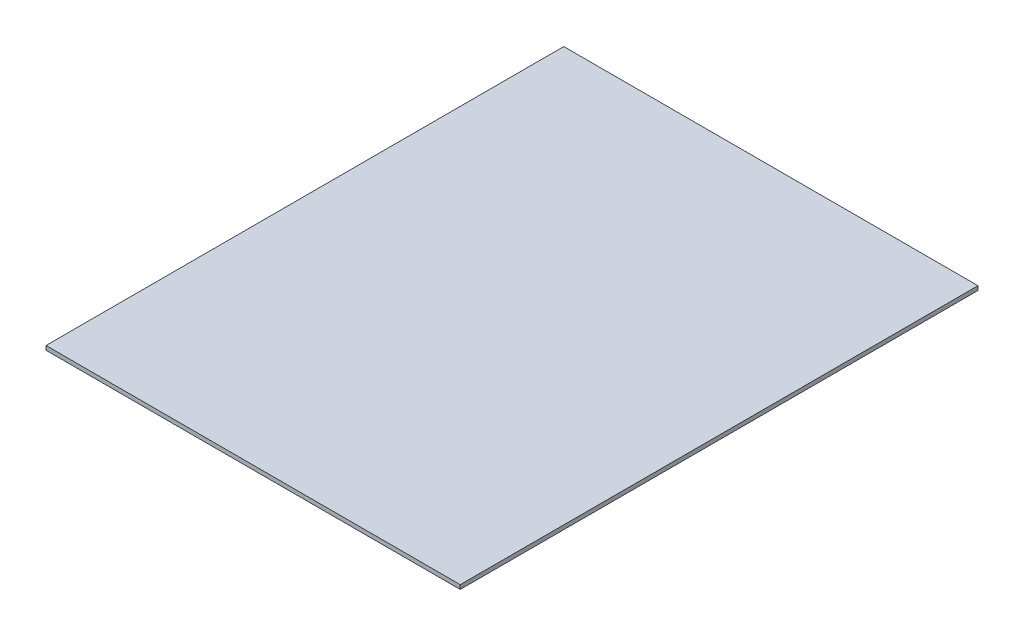
ISO-10303-21;
HEADER;
FILE_DESCRIPTION(('STEP AP214'),'2;1');
FILE_NAME('part.step','',(''),(''),'','','');
FILE_SCHEMA(('AUTOMOTIVE_DESIGN { 1 0 10303 214 1 1 1 1 }'));
ENDSEC;
DATA;
#1=APPLICATION_CONTEXT('core data for automotive mechanical design processes');
#2=APPLICATION_PROTOCOL_DEFINITION('international standard','automotive_design',2000,#1);
#3=PRODUCT_CONTEXT('',#1,'mechanical');
#4=PRODUCT('Part','Part','',(#3));
#5=PRODUCT_RELATED_PRODUCT_CATEGORY('part','',(#4));
#6=PRODUCT_DEFINITION_FORMATION('','',#4);
#7=PRODUCT_DEFINITION_CONTEXT('part definition',#1,'design');
#8=PRODUCT_DEFINITION('design','',#6,#7);
#9=PRODUCT_DEFINITION_SHAPE('','',#8);
#10=(LENGTH_UNIT() NAMED_UNIT(*) SI_UNIT(.MILLI.,.METRE.));
#11=(NAMED_UNIT(*) PLANE_ANGLE_UNIT() SI_UNIT($,.RADIAN.));
#12=(NAMED_UNIT(*) SI_UNIT($,.STERADIAN.) SOLID_ANGLE_UNIT());
#13=UNCERTAINTY_MEASURE_WITH_UNIT(LENGTH_MEASURE(1.E-05),#10,'distance_accuracy_value','');
#14=(GEOMETRIC_REPRESENTATION_CONTEXT(3) GLOBAL_UNCERTAINTY_ASSIGNED_CONTEXT((#13)) GLOBAL_UNIT_ASSIGNED_CONTEXT((#10,
#11,#12)) REPRESENTATION_CONTEXT('',''));
#15=CARTESIAN_POINT('',(0.,0.,0.));
#16=DIRECTION('',(0.,0.,1.));
#17=DIRECTION('',(1.,0.,0.));
#18=AXIS2_PLACEMENT_3D('',#15,#16,#17);
#19=CARTESIAN_POINT('',(150.,1446.,-560.));
#20=DIRECTION('',(-1.,0.,0.));
#21=DIRECTION('',(0.,0.,1.));
#22=AXIS2_PLACEMENT_3D('',#19,#20,#21);
#23=PLANE('',#22);
#24=DIRECTION('',(0.,-1.,0.));
#25=VECTOR('',#24,1.);
#26=CARTESIAN_POINT('',(150.,1446.,-60.));
#27=LINE('',#26,#25);
#28=CARTESIAN_POINT('',(150.,1450.,-60.));
#29=VERTEX_POINT('',#28);
#30=CARTESIAN_POINT('',(150.,1446.,-60.));
#31=VERTEX_POINT('',#30);
#32=EDGE_CURVE('E103',#29,#31,#27,.T.);
#33=ORIENTED_EDGE('',*,*,#32,.F.);
#34=DIRECTION('',(0.,0.,1.));
#35=VECTOR('',#34,1.);
#36=CARTESIAN_POINT('',(150.,1450.,-560.));
#37=LINE('',#36,#35);
#38=CARTESIAN_POINT('',(150.,1450.,-560.));
#39=VERTEX_POINT('',#38);
#40=EDGE_CURVE('E11',#39,#29,#37,.T.);
#41=ORIENTED_EDGE('',*,*,#40,.F.);
#42=DIRECTION('',(0.,-1.,0.));
#43=VECTOR('',#42,1.);
#44=CARTESIAN_POINT('',(150.,1446.,-560.));
#45=LINE('',#44,#43);
#46=CARTESIAN_POINT('',(150.,1446.,-560.));
#47=VERTEX_POINT('',#46);
#48=EDGE_CURVE('E97',#39,#47,#45,.T.);
#49=ORIENTED_EDGE('',*,*,#48,.T.);
#50=DIRECTION('',(0.,0.,1.));
#51=VECTOR('',#50,1.);
#52=CARTESIAN_POINT('',(150.,1446.,-560.));
#53=LINE('',#52,#51);
#54=EDGE_CURVE('E42',#47,#31,#53,.T.);
#55=ORIENTED_EDGE('',*,*,#54,.T.);
#56=EDGE_LOOP('',(#33,#41,#49,#55));
#57=FACE_BOUND('',#56,.T.);
#58=ADVANCED_FACE('F39',(#57),#23,.T.);
#59=CARTESIAN_POINT('',(150.,1450.,-560.));
#60=DIRECTION('',(0.,1.,0.));
#61=DIRECTION('',(0.,0.,1.));
#62=AXIS2_PLACEMENT_3D('',#59,#60,#61);
#63=PLANE('',#62);
#64=DIRECTION('',(-1.,0.,0.));
#65=VECTOR('',#64,1.);
#66=CARTESIAN_POINT('',(150.,1450.,-60.));
#67=LINE('',#66,#65);
#68=CARTESIAN_POINT('',(550.,1450.,-60.));
#69=VERTEX_POINT('',#68);
#70=EDGE_CURVE('E99',#69,#29,#67,.T.);
#71=ORIENTED_EDGE('',*,*,#70,.F.);
#72=DIRECTION('',(0.,0.,1.));
#73=VECTOR('',#72,1.);
#74=CARTESIAN_POINT('',(550.,1450.,-560.));
#75=LINE('',#74,#73);
#76=CARTESIAN_POINT('',(550.,1450.,-560.));
#77=VERTEX_POINT('',#76);
#78=EDGE_CURVE('E48',#77,#69,#75,.T.);
#79=ORIENTED_EDGE('',*,*,#78,.F.);
#80=DIRECTION('',(-1.,0.,0.));
#81=VECTOR('',#80,1.);
#82=CARTESIAN_POINT('',(150.,1450.,-560.));
#83=LINE('',#82,#81);
#84=EDGE_CURVE('E94',#77,#39,#83,.T.);
#85=ORIENTED_EDGE('',*,*,#84,.T.);
#86=ORIENTED_EDGE('',*,*,#40,.T.);
#87=EDGE_LOOP('',(#71,#79,#85,#86));
#88=FACE_BOUND('',#87,.T.);
#89=ADVANCED_FACE('F113',(#88),#63,.T.);
#90=CARTESIAN_POINT('',(550.,1446.,-560.));
#91=DIRECTION('',(1.,0.,0.));
#92=DIRECTION('',(0.,0.,-1.));
#93=AXIS2_PLACEMENT_3D('',#90,#91,#92);
#94=PLANE('',#93);
#95=DIRECTION('',(0.,1.,0.));
#96=VECTOR('',#95,1.);
#97=CARTESIAN_POINT('',(550.,1446.,-60.));
#98=LINE('',#97,#96);
#99=CARTESIAN_POINT('',(550.,1446.,-60.));
#100=VERTEX_POINT('',#99);
#101=EDGE_CURVE('E89',#100,#69,#98,.T.);
#102=ORIENTED_EDGE('',*,*,#101,.F.);
#103=DIRECTION('',(0.,0.,1.));
#104=VECTOR('',#103,1.);
#105=CARTESIAN_POINT('',(550.,1446.,-560.));
#106=LINE('',#105,#104);
#107=CARTESIAN_POINT('',(550.,1446.,-560.));
#108=VERTEX_POINT('',#107);
#109=EDGE_CURVE('E84',#108,#100,#106,.T.);
#110=ORIENTED_EDGE('',*,*,#109,.F.);
#111=DIRECTION('',(0.,1.,0.));
#112=VECTOR('',#111,1.);
#113=CARTESIAN_POINT('',(550.,1446.,-560.));
#114=LINE('',#113,#112);
#115=EDGE_CURVE('E87',#108,#77,#114,.T.);
#116=ORIENTED_EDGE('',*,*,#115,.T.);
#117=ORIENTED_EDGE('',*,*,#78,.T.);
#118=EDGE_LOOP('',(#102,#110,#116,#117));
#119=FACE_BOUND('',#118,.T.);
#120=ADVANCED_FACE('F86',(#119),#94,.T.);
#121=CARTESIAN_POINT('',(150.,1446.,-560.));
#122=DIRECTION('',(0.,-1.,0.));
#123=DIRECTION('',(0.,0.,-1.));
#124=AXIS2_PLACEMENT_3D('',#121,#122,#123);
#125=PLANE('',#124);
#126=DIRECTION('',(1.,0.,0.));
#127=VECTOR('',#126,1.);
#128=CARTESIAN_POINT('',(150.,1446.,-60.));
#129=LINE('',#128,#127);
#130=EDGE_CURVE('E106',#31,#100,#129,.T.);
#131=ORIENTED_EDGE('',*,*,#130,.F.);
#132=ORIENTED_EDGE('',*,*,#54,.F.);
#133=DIRECTION('',(1.,0.,0.));
#134=VECTOR('',#133,1.);
#135=CARTESIAN_POINT('',(150.,1446.,-560.));
#136=LINE('',#135,#134);
#137=EDGE_CURVE('E93',#47,#108,#136,.T.);
#138=ORIENTED_EDGE('',*,*,#137,.T.);
#139=ORIENTED_EDGE('',*,*,#109,.T.);
#140=EDGE_LOOP('',(#131,#132,#138,#139));
#141=FACE_BOUND('',#140,.T.);
#142=ADVANCED_FACE('F96',(#141),#125,.T.);
#143=CARTESIAN_POINT('',(0.,0.,-560.));
#144=DIRECTION('',(0.,0.,-1.));
#145=DIRECTION('',(-1.,0.,0.));
#146=AXIS2_PLACEMENT_3D('',#143,#144,#145);
#147=PLANE('',#146);
#148=ORIENTED_EDGE('',*,*,#48,.F.);
#149=ORIENTED_EDGE('',*,*,#84,.F.);
#150=ORIENTED_EDGE('',*,*,#115,.F.);
#151=ORIENTED_EDGE('',*,*,#137,.F.);
#152=EDGE_LOOP('',(#148,#149,#150,#151));
#153=FACE_BOUND('',#152,.T.);
#154=ADVANCED_FACE('F92',(#153),#147,.T.);
#155=CARTESIAN_POINT('',(0.,0.,-60.));
#156=DIRECTION('',(0.,0.,-1.));
#157=DIRECTION('',(-1.,0.,0.));
#158=AXIS2_PLACEMENT_3D('',#155,#156,#157);
#159=PLANE('',#158);
#160=ORIENTED_EDGE('',*,*,#32,.T.);
#161=ORIENTED_EDGE('',*,*,#130,.T.);
#162=ORIENTED_EDGE('',*,*,#101,.T.);
#163=ORIENTED_EDGE('',*,*,#70,.T.);
#164=EDGE_LOOP('',(#160,#161,#162,#163));
#165=FACE_BOUND('',#164,.T.);
#166=ADVANCED_FACE('F112',(#165),#159,.F.);
#167=CLOSED_SHELL('',(#58,#89,#120,#142,#154,#166));
#168=MANIFOLD_SOLID_BREP('B2',#167);
#169=ADVANCED_BREP_SHAPE_REPRESENTATION('',(#18,#168),#14);
#170=SHAPE_DEFINITION_REPRESENTATION(#9,#169);
ENDSEC;
END-ISO-10303-21;
